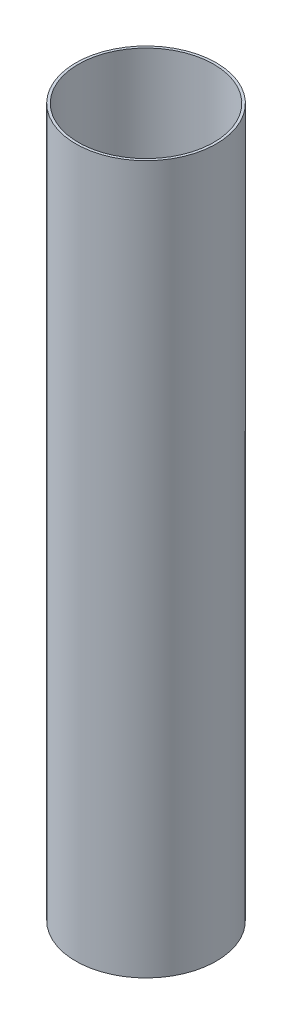
ISO-10303-21;
HEADER;
FILE_DESCRIPTION(('STEP AP214'),'2;1');
FILE_NAME('part.step','',(''),(''),'','','');
FILE_SCHEMA(('AUTOMOTIVE_DESIGN { 1 0 10303 214 1 1 1 1 }'));
ENDSEC;
DATA;
#1=APPLICATION_CONTEXT('core data for automotive mechanical design processes');
#2=APPLICATION_PROTOCOL_DEFINITION('international standard','automotive_design',2000,#1);
#3=PRODUCT_CONTEXT('',#1,'mechanical');
#4=PRODUCT('Part','Part','',(#3));
#5=PRODUCT_RELATED_PRODUCT_CATEGORY('part','',(#4));
#6=PRODUCT_DEFINITION_FORMATION('','',#4);
#7=PRODUCT_DEFINITION_CONTEXT('part definition',#1,'design');
#8=PRODUCT_DEFINITION('design','',#6,#7);
#9=PRODUCT_DEFINITION_SHAPE('','',#8);
#10=(LENGTH_UNIT() NAMED_UNIT(*) SI_UNIT(.MILLI.,.METRE.));
#11=(NAMED_UNIT(*) PLANE_ANGLE_UNIT() SI_UNIT($,.RADIAN.));
#12=(NAMED_UNIT(*) SI_UNIT($,.STERADIAN.) SOLID_ANGLE_UNIT());
#13=UNCERTAINTY_MEASURE_WITH_UNIT(LENGTH_MEASURE(1.E-05),#10,'distance_accuracy_value','');
#14=(GEOMETRIC_REPRESENTATION_CONTEXT(3) GLOBAL_UNCERTAINTY_ASSIGNED_CONTEXT((#13)) GLOBAL_UNIT_ASSIGNED_CONTEXT((#10,
#11,#12)) REPRESENTATION_CONTEXT('',''));
#15=CARTESIAN_POINT('',(0.,0.,0.));
#16=DIRECTION('',(0.,0.,1.));
#17=DIRECTION('',(1.,0.,0.));
#18=AXIS2_PLACEMENT_3D('',#15,#16,#17);
#19=CARTESIAN_POINT('',(0.,0.,0.));
#20=DIRECTION('',(0.,-1.,0.));
#21=DIRECTION('',(0.,0.,-1.));
#22=AXIS2_PLACEMENT_3D('',#19,#20,#21);
#23=CYLINDRICAL_SURFACE('',#22,67.);
#24=CARTESIAN_POINT('',(0.,0.,0.));
#25=DIRECTION('',(0.,-1.,0.));
#26=DIRECTION('',(0.,0.,-1.));
#27=AXIS2_PLACEMENT_3D('',#24,#25,#26);
#28=CIRCLE('',#27,67.);
#29=CARTESIAN_POINT('',(0.,0.,-67.));
#30=VERTEX_POINT('',#29);
#31=EDGE_CURVE('E26',#30,#30,#28,.T.);
#32=ORIENTED_EDGE('',*,*,#31,.F.);
#33=EDGE_LOOP('',(#32));
#34=FACE_BOUND('',#33,.T.);
#35=CARTESIAN_POINT('',(0.,-700.,0.));
#36=DIRECTION('',(0.,-1.,0.));
#37=DIRECTION('',(0.,0.,-1.));
#38=AXIS2_PLACEMENT_3D('',#35,#36,#37);
#39=CIRCLE('',#38,67.);
#40=CARTESIAN_POINT('',(0.,-700.,-67.));
#41=VERTEX_POINT('',#40);
#42=EDGE_CURVE('E17',#41,#41,#39,.T.);
#43=ORIENTED_EDGE('',*,*,#42,.T.);
#44=EDGE_LOOP('',(#43));
#45=FACE_BOUND('',#44,.T.);
#46=ADVANCED_FACE('F14',(#34,#45),#23,.F.);
#47=CARTESIAN_POINT('',(0.,-700.,0.));
#48=DIRECTION('',(0.,1.,0.));
#49=DIRECTION('',(0.,0.,1.));
#50=AXIS2_PLACEMENT_3D('',#47,#48,#49);
#51=PLANE('',#50);
#52=ORIENTED_EDGE('',*,*,#42,.F.);
#53=EDGE_LOOP('',(#52));
#54=FACE_BOUND('',#53,.T.);
#55=CARTESIAN_POINT('',(0.,-700.,0.));
#56=DIRECTION('',(0.,-1.,0.));
#57=DIRECTION('',(0.,0.,-1.));
#58=AXIS2_PLACEMENT_3D('',#55,#56,#57);
#59=CIRCLE('',#58,69.5);
#60=CARTESIAN_POINT('',(0.,-700.,-69.5));
#61=VERTEX_POINT('',#60);
#62=EDGE_CURVE('E21',#61,#61,#59,.F.);
#63=ORIENTED_EDGE('',*,*,#62,.F.);
#64=EDGE_LOOP('',(#63));
#65=FACE_BOUND('',#64,.T.);
#66=ADVANCED_FACE('F35',(#54,#65),#51,.F.);
#67=CARTESIAN_POINT('',(0.,0.,0.));
#68=DIRECTION('',(0.,1.,0.));
#69=DIRECTION('',(0.,0.,1.));
#70=AXIS2_PLACEMENT_3D('',#67,#68,#69);
#71=PLANE('',#70);
#72=ORIENTED_EDGE('',*,*,#31,.T.);
#73=EDGE_LOOP('',(#72));
#74=FACE_BOUND('',#73,.T.);
#75=CARTESIAN_POINT('',(0.,0.,0.));
#76=DIRECTION('',(0.,-1.,0.));
#77=DIRECTION('',(0.,0.,-1.));
#78=AXIS2_PLACEMENT_3D('',#75,#76,#77);
#79=CIRCLE('',#78,69.5);
#80=CARTESIAN_POINT('',(0.,0.,-69.5));
#81=VERTEX_POINT('',#80);
#82=EDGE_CURVE('E10',#81,#81,#79,.T.);
#83=ORIENTED_EDGE('',*,*,#82,.F.);
#84=EDGE_LOOP('',(#83));
#85=FACE_BOUND('',#84,.T.);
#86=ADVANCED_FACE('F38',(#74,#85),#71,.T.);
#87=CARTESIAN_POINT('',(0.,0.,0.));
#88=DIRECTION('',(0.,-1.,0.));
#89=DIRECTION('',(0.,0.,-1.));
#90=AXIS2_PLACEMENT_3D('',#87,#88,#89);
#91=CYLINDRICAL_SURFACE('',#90,69.5);
#92=ORIENTED_EDGE('',*,*,#82,.T.);
#93=EDGE_LOOP('',(#92));
#94=FACE_BOUND('',#93,.T.);
#95=ORIENTED_EDGE('',*,*,#62,.T.);
#96=EDGE_LOOP('',(#95));
#97=FACE_BOUND('',#96,.T.);
#98=ADVANCED_FACE('F41',(#94,#97),#91,.T.);
#99=CLOSED_SHELL('',(#46,#66,#86,#98));
#100=MANIFOLD_SOLID_BREP('B1',#99);
#101=ADVANCED_BREP_SHAPE_REPRESENTATION('',(#18,#100),#14);
#102=SHAPE_DEFINITION_REPRESENTATION(#9,#101);
ENDSEC;
END-ISO-10303-21;
